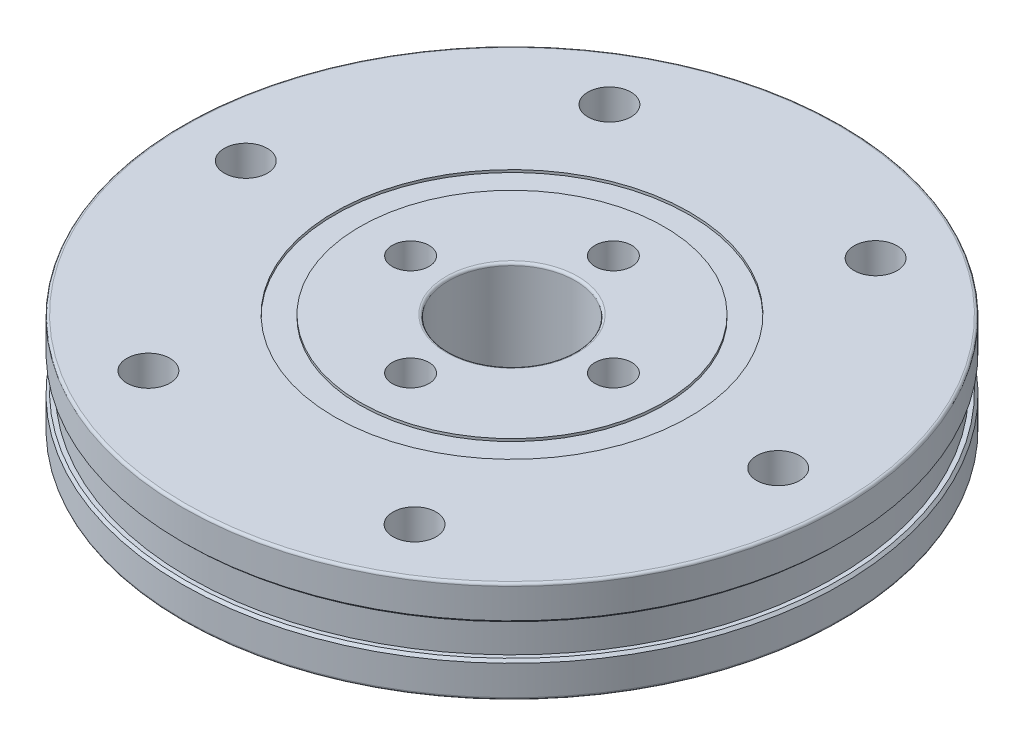
ISO-10303-21;
HEADER;
FILE_DESCRIPTION(('STEP AP214'),'2;1');
FILE_NAME('part.step','',(''),(''),'','','');
FILE_SCHEMA(('AUTOMOTIVE_DESIGN { 1 0 10303 214 1 1 1 1 }'));
ENDSEC;
DATA;
#1=APPLICATION_CONTEXT('core data for automotive mechanical design processes');
#2=APPLICATION_PROTOCOL_DEFINITION('international standard','automotive_design',2000,#1);
#3=PRODUCT_CONTEXT('',#1,'mechanical');
#4=PRODUCT('Part','Part','',(#3));
#5=PRODUCT_RELATED_PRODUCT_CATEGORY('part','',(#4));
#6=PRODUCT_DEFINITION_FORMATION('','',#4);
#7=PRODUCT_DEFINITION_CONTEXT('part definition',#1,'design');
#8=PRODUCT_DEFINITION('design','',#6,#7);
#9=PRODUCT_DEFINITION_SHAPE('','',#8);
#10=(LENGTH_UNIT() NAMED_UNIT(*) SI_UNIT(.MILLI.,.METRE.));
#11=(NAMED_UNIT(*) PLANE_ANGLE_UNIT() SI_UNIT($,.RADIAN.));
#12=(NAMED_UNIT(*) SI_UNIT($,.STERADIAN.) SOLID_ANGLE_UNIT());
#13=UNCERTAINTY_MEASURE_WITH_UNIT(LENGTH_MEASURE(1.E-05),#10,'distance_accuracy_value','');
#14=(GEOMETRIC_REPRESENTATION_CONTEXT(3) GLOBAL_UNCERTAINTY_ASSIGNED_CONTEXT((#13)) GLOBAL_UNIT_ASSIGNED_CONTEXT((#10,
#11,#12)) REPRESENTATION_CONTEXT('',''));
#15=CARTESIAN_POINT('',(0.,0.,0.));
#16=DIRECTION('',(0.,0.,1.));
#17=DIRECTION('',(1.,0.,0.));
#18=AXIS2_PLACEMENT_3D('',#15,#16,#17);
#19=CARTESIAN_POINT('',(10.5,4.,-18.1865334794732));
#20=DIRECTION('',(0.,-1.,0.));
#21=DIRECTION('',(0.,0.,-1.));
#22=AXIS2_PLACEMENT_3D('',#19,#20,#21);
#23=CYLINDRICAL_SURFACE('',#22,1.7);
#24=CARTESIAN_POINT('',(10.5,4.,-18.1865334794732));
#25=DIRECTION('',(0.,1.,0.));
#26=DIRECTION('',(0.,0.,1.));
#27=AXIS2_PLACEMENT_3D('',#24,#25,#26);
#28=CIRCLE('',#27,1.7);
#29=CARTESIAN_POINT('',(10.5,4.,-16.4865334794732));
#30=VERTEX_POINT('',#29);
#31=EDGE_CURVE('E188',#30,#30,#28,.T.);
#32=ORIENTED_EDGE('',*,*,#31,.T.);
#33=EDGE_LOOP('',(#32));
#34=FACE_BOUND('',#33,.T.);
#35=CARTESIAN_POINT('',(10.5,-0.7,-18.1865334794732));
#36=DIRECTION('',(0.,-1.,0.));
#37=DIRECTION('',(0.,0.,-1.));
#38=AXIS2_PLACEMENT_3D('',#35,#36,#37);
#39=CIRCLE('',#38,1.7);
#40=CARTESIAN_POINT('',(10.5,-0.7,-19.8865334794732));
#41=VERTEX_POINT('',#40);
#42=EDGE_CURVE('E52',#41,#41,#39,.T.);
#43=ORIENTED_EDGE('',*,*,#42,.T.);
#44=EDGE_LOOP('',(#43));
#45=FACE_BOUND('',#44,.T.);
#46=ADVANCED_FACE('F48',(#34,#45),#23,.F.);
#47=CARTESIAN_POINT('',(-10.5,4.,-18.1865334794732));
#48=DIRECTION('',(0.,-1.,0.));
#49=DIRECTION('',(0.,0.,-1.));
#50=AXIS2_PLACEMENT_3D('',#47,#48,#49);
#51=CYLINDRICAL_SURFACE('',#50,1.7);
#52=CARTESIAN_POINT('',(-10.5,4.,-18.1865334794732));
#53=DIRECTION('',(0.,1.,0.));
#54=DIRECTION('',(0.,0.,1.));
#55=AXIS2_PLACEMENT_3D('',#52,#53,#54);
#56=CIRCLE('',#55,1.7);
#57=CARTESIAN_POINT('',(-10.5,4.,-16.4865334794732));
#58=VERTEX_POINT('',#57);
#59=EDGE_CURVE('E184',#58,#58,#56,.T.);
#60=ORIENTED_EDGE('',*,*,#59,.T.);
#61=EDGE_LOOP('',(#60));
#62=FACE_BOUND('',#61,.T.);
#63=CARTESIAN_POINT('',(-10.5,-0.7,-18.1865334794732));
#64=DIRECTION('',(0.,-1.,0.));
#65=DIRECTION('',(0.,0.,-1.));
#66=AXIS2_PLACEMENT_3D('',#63,#64,#65);
#67=CIRCLE('',#66,1.7);
#68=CARTESIAN_POINT('',(-10.5,-0.7,-19.8865334794732));
#69=VERTEX_POINT('',#68);
#70=EDGE_CURVE('E83',#69,#69,#67,.T.);
#71=ORIENTED_EDGE('',*,*,#70,.T.);
#72=EDGE_LOOP('',(#71));
#73=FACE_BOUND('',#72,.T.);
#74=ADVANCED_FACE('F259',(#62,#73),#51,.F.);
#75=CARTESIAN_POINT('',(21.,4.,0.));
#76=DIRECTION('',(0.,-1.,0.));
#77=DIRECTION('',(0.,0.,-1.));
#78=AXIS2_PLACEMENT_3D('',#75,#76,#77);
#79=CYLINDRICAL_SURFACE('',#78,1.7);
#80=CARTESIAN_POINT('',(21.,4.,0.));
#81=DIRECTION('',(0.,1.,0.));
#82=DIRECTION('',(0.,0.,1.));
#83=AXIS2_PLACEMENT_3D('',#80,#81,#82);
#84=CIRCLE('',#83,1.7);
#85=CARTESIAN_POINT('',(21.,4.,1.69999999999999));
#86=VERTEX_POINT('',#85);
#87=EDGE_CURVE('E180',#86,#86,#84,.T.);
#88=ORIENTED_EDGE('',*,*,#87,.T.);
#89=EDGE_LOOP('',(#88));
#90=FACE_BOUND('',#89,.T.);
#91=CARTESIAN_POINT('',(21.,-0.7,0.));
#92=DIRECTION('',(0.,-1.,0.));
#93=DIRECTION('',(0.,0.,-1.));
#94=AXIS2_PLACEMENT_3D('',#91,#92,#93);
#95=CIRCLE('',#94,1.7);
#96=CARTESIAN_POINT('',(21.,-0.7,-1.70000000000001));
#97=VERTEX_POINT('',#96);
#98=EDGE_CURVE('E80',#97,#97,#95,.T.);
#99=ORIENTED_EDGE('',*,*,#98,.T.);
#100=EDGE_LOOP('',(#99));
#101=FACE_BOUND('',#100,.T.);
#102=ADVANCED_FACE('F266',(#90,#101),#79,.F.);
#103=CARTESIAN_POINT('',(10.5,4.,18.1865334794732));
#104=DIRECTION('',(0.,-1.,0.));
#105=DIRECTION('',(0.,0.,-1.));
#106=AXIS2_PLACEMENT_3D('',#103,#104,#105);
#107=CYLINDRICAL_SURFACE('',#106,1.7);
#108=CARTESIAN_POINT('',(10.5,4.,18.1865334794732));
#109=DIRECTION('',(0.,1.,0.));
#110=DIRECTION('',(0.,0.,1.));
#111=AXIS2_PLACEMENT_3D('',#108,#109,#110);
#112=CIRCLE('',#111,1.7);
#113=CARTESIAN_POINT('',(10.5,4.,19.8865334794732));
#114=VERTEX_POINT('',#113);
#115=EDGE_CURVE('E176',#114,#114,#112,.T.);
#116=ORIENTED_EDGE('',*,*,#115,.T.);
#117=EDGE_LOOP('',(#116));
#118=FACE_BOUND('',#117,.T.);
#119=CARTESIAN_POINT('',(10.5,-0.7,18.1865334794732));
#120=DIRECTION('',(0.,-1.,0.));
#121=DIRECTION('',(0.,0.,-1.));
#122=AXIS2_PLACEMENT_3D('',#119,#120,#121);
#123=CIRCLE('',#122,1.7);
#124=CARTESIAN_POINT('',(10.5,-0.7,16.4865334794732));
#125=VERTEX_POINT('',#124);
#126=EDGE_CURVE('E76',#125,#125,#123,.T.);
#127=ORIENTED_EDGE('',*,*,#126,.T.);
#128=EDGE_LOOP('',(#127));
#129=FACE_BOUND('',#128,.T.);
#130=ADVANCED_FACE('F272',(#118,#129),#107,.F.);
#131=CARTESIAN_POINT('',(-10.5,4.,18.1865334794732));
#132=DIRECTION('',(0.,-1.,0.));
#133=DIRECTION('',(0.,0.,-1.));
#134=AXIS2_PLACEMENT_3D('',#131,#132,#133);
#135=CYLINDRICAL_SURFACE('',#134,1.7);
#136=CARTESIAN_POINT('',(-10.5,4.,18.1865334794732));
#137=DIRECTION('',(0.,1.,0.));
#138=DIRECTION('',(0.,0.,1.));
#139=AXIS2_PLACEMENT_3D('',#136,#137,#138);
#140=CIRCLE('',#139,1.7);
#141=CARTESIAN_POINT('',(-10.5,4.,19.8865334794732));
#142=VERTEX_POINT('',#141);
#143=EDGE_CURVE('E172',#142,#142,#140,.T.);
#144=ORIENTED_EDGE('',*,*,#143,.T.);
#145=EDGE_LOOP('',(#144));
#146=FACE_BOUND('',#145,.T.);
#147=CARTESIAN_POINT('',(-10.5,-0.7,18.1865334794732));
#148=DIRECTION('',(0.,-1.,0.));
#149=DIRECTION('',(0.,0.,-1.));
#150=AXIS2_PLACEMENT_3D('',#147,#148,#149);
#151=CIRCLE('',#150,1.7);
#152=CARTESIAN_POINT('',(-10.5,-0.7,16.4865334794732));
#153=VERTEX_POINT('',#152);
#154=EDGE_CURVE('E71',#153,#153,#151,.T.);
#155=ORIENTED_EDGE('',*,*,#154,.T.);
#156=EDGE_LOOP('',(#155));
#157=FACE_BOUND('',#156,.T.);
#158=ADVANCED_FACE('F276',(#146,#157),#135,.F.);
#159=CARTESIAN_POINT('',(-21.,4.,0.));
#160=DIRECTION('',(0.,-1.,0.));
#161=DIRECTION('',(0.,0.,-1.));
#162=AXIS2_PLACEMENT_3D('',#159,#160,#161);
#163=CYLINDRICAL_SURFACE('',#162,1.7);
#164=CARTESIAN_POINT('',(-21.,4.,0.));
#165=DIRECTION('',(0.,1.,0.));
#166=DIRECTION('',(0.,0.,1.));
#167=AXIS2_PLACEMENT_3D('',#164,#165,#166);
#168=CIRCLE('',#167,1.7);
#169=CARTESIAN_POINT('',(-21.,4.,1.7));
#170=VERTEX_POINT('',#169);
#171=EDGE_CURVE('E165',#170,#170,#168,.T.);
#172=ORIENTED_EDGE('',*,*,#171,.T.);
#173=EDGE_LOOP('',(#172));
#174=FACE_BOUND('',#173,.T.);
#175=CARTESIAN_POINT('',(-21.,-0.7,0.));
#176=DIRECTION('',(0.,-1.,0.));
#177=DIRECTION('',(0.,0.,-1.));
#178=AXIS2_PLACEMENT_3D('',#175,#176,#177);
#179=CIRCLE('',#178,1.7);
#180=CARTESIAN_POINT('',(-21.,-0.7,-1.7));
#181=VERTEX_POINT('',#180);
#182=EDGE_CURVE('E67',#181,#181,#179,.T.);
#183=ORIENTED_EDGE('',*,*,#182,.T.);
#184=EDGE_LOOP('',(#183));
#185=FACE_BOUND('',#184,.T.);
#186=ADVANCED_FACE('F280',(#174,#185),#163,.F.);
#187=CARTESIAN_POINT('',(0.,4.,0.));
#188=DIRECTION('',(0.,-1.,0.));
#189=DIRECTION('',(0.,0.,-1.));
#190=AXIS2_PLACEMENT_3D('',#187,#188,#189);
#191=CYLINDRICAL_SURFACE('',#190,26.);
#192=CARTESIAN_POINT('',(0.,-3.8,0.));
#193=DIRECTION('',(0.,1.,0.));
#194=DIRECTION('',(0.,0.,1.));
#195=AXIS2_PLACEMENT_3D('',#192,#193,#194);
#196=CIRCLE('',#195,26.);
#197=CARTESIAN_POINT('',(0.,-3.8,26.));
#198=VERTEX_POINT('',#197);
#199=EDGE_CURVE('E220',#198,#198,#196,.T.);
#200=ORIENTED_EDGE('',*,*,#199,.T.);
#201=EDGE_LOOP('',(#200));
#202=FACE_BOUND('',#201,.T.);
#203=CARTESIAN_POINT('',(0.,-1.45,0.));
#204=DIRECTION('',(0.,1.,0.));
#205=DIRECTION('',(0.,0.,1.));
#206=AXIS2_PLACEMENT_3D('',#203,#204,#205);
#207=CIRCLE('',#206,26.);
#208=CARTESIAN_POINT('',(0.,-1.45,26.));
#209=VERTEX_POINT('',#208);
#210=EDGE_CURVE('E196',#209,#209,#207,.F.);
#211=ORIENTED_EDGE('',*,*,#210,.T.);
#212=EDGE_LOOP('',(#211));
#213=FACE_BOUND('',#212,.T.);
#214=ADVANCED_FACE('F255',(#202,#213),#191,.T.);
#215=CARTESIAN_POINT('',(0.,-4.,0.));
#216=DIRECTION('',(0.,1.,0.));
#217=DIRECTION('',(0.,0.,1.));
#218=AXIS2_PLACEMENT_3D('',#215,#216,#217);
#219=PLANE('',#218);
#220=CARTESIAN_POINT('',(0.,-4.,0.));
#221=DIRECTION('',(0.,1.,0.));
#222=DIRECTION('',(0.,0.,1.));
#223=AXIS2_PLACEMENT_3D('',#220,#221,#222);
#224=CIRCLE('',#223,5.2);
#225=CARTESIAN_POINT('',(0.,-4.,5.2));
#226=VERTEX_POINT('',#225);
#227=EDGE_CURVE('E208',#226,#226,#224,.T.);
#228=ORIENTED_EDGE('',*,*,#227,.T.);
#229=EDGE_LOOP('',(#228));
#230=FACE_BOUND('',#229,.T.);
#231=CARTESIAN_POINT('',(-7.99999999999999,-4.,0.));
#232=DIRECTION('',(0.,1.,0.));
#233=DIRECTION('',(0.,0.,1.));
#234=AXIS2_PLACEMENT_3D('',#231,#232,#233);
#235=CIRCLE('',#234,1.45);
#236=CARTESIAN_POINT('',(-7.99999999999999,-4.,1.45));
#237=VERTEX_POINT('',#236);
#238=EDGE_CURVE('E133',#237,#237,#235,.T.);
#239=ORIENTED_EDGE('',*,*,#238,.T.);
#240=EDGE_LOOP('',(#239));
#241=FACE_BOUND('',#240,.T.);
#242=CARTESIAN_POINT('',(0.,-4.,8.));
#243=DIRECTION('',(0.,1.,0.));
#244=DIRECTION('',(0.,0.,1.));
#245=AXIS2_PLACEMENT_3D('',#242,#243,#244);
#246=CIRCLE('',#245,1.45);
#247=CARTESIAN_POINT('',(0.,-4.,9.45));
#248=VERTEX_POINT('',#247);
#249=EDGE_CURVE('E141',#248,#248,#246,.T.);
#250=ORIENTED_EDGE('',*,*,#249,.T.);
#251=EDGE_LOOP('',(#250));
#252=FACE_BOUND('',#251,.T.);
#253=CARTESIAN_POINT('',(0.,-4.,-7.99999999999999));
#254=DIRECTION('',(0.,1.,0.));
#255=DIRECTION('',(0.,0.,1.));
#256=AXIS2_PLACEMENT_3D('',#253,#254,#255);
#257=CIRCLE('',#256,1.45);
#258=CARTESIAN_POINT('',(0.,-4.,-6.54999999999999));
#259=VERTEX_POINT('',#258);
#260=EDGE_CURVE('E149',#259,#259,#257,.T.);
#261=ORIENTED_EDGE('',*,*,#260,.T.);
#262=EDGE_LOOP('',(#261));
#263=FACE_BOUND('',#262,.T.);
#264=CARTESIAN_POINT('',(7.99999999999999,-4.,0.));
#265=DIRECTION('',(0.,1.,0.));
#266=DIRECTION('',(0.,0.,1.));
#267=AXIS2_PLACEMENT_3D('',#264,#265,#266);
#268=CIRCLE('',#267,1.45);
#269=CARTESIAN_POINT('',(7.99999999999999,-4.,1.45000000000001));
#270=VERTEX_POINT('',#269);
#271=EDGE_CURVE('E157',#270,#270,#268,.T.);
#272=ORIENTED_EDGE('',*,*,#271,.T.);
#273=EDGE_LOOP('',(#272));
#274=FACE_BOUND('',#273,.T.);
#275=CARTESIAN_POINT('',(0.,-4.,0.));
#276=DIRECTION('',(0.,-1.,0.));
#277=DIRECTION('',(0.,0.,-1.));
#278=AXIS2_PLACEMENT_3D('',#275,#276,#277);
#279=CIRCLE('',#278,12.);
#280=CARTESIAN_POINT('',(0.,-4.,-12.));
#281=VERTEX_POINT('',#280);
#282=EDGE_CURVE('E101',#281,#281,#279,.T.);
#283=ORIENTED_EDGE('',*,*,#282,.T.);
#284=EDGE_LOOP('',(#283));
#285=FACE_BOUND('',#284,.T.);
#286=ADVANCED_FACE('F439',(#230,#241,#252,#263,#274,#285),#219,.F.);
#287=CARTESIAN_POINT('',(0.,4.,0.));
#288=DIRECTION('',(0.,1.,0.));
#289=DIRECTION('',(0.,0.,1.));
#290=AXIS2_PLACEMENT_3D('',#287,#288,#289);
#291=PLANE('',#290);
#292=CARTESIAN_POINT('',(0.,4.,0.));
#293=DIRECTION('',(0.,1.,0.));
#294=DIRECTION('',(0.,0.,1.));
#295=AXIS2_PLACEMENT_3D('',#292,#293,#294);
#296=CIRCLE('',#295,5.2);
#297=CARTESIAN_POINT('',(0.,4.,5.2));
#298=VERTEX_POINT('',#297);
#299=EDGE_CURVE('E63',#298,#298,#296,.F.);
#300=ORIENTED_EDGE('',*,*,#299,.T.);
#301=EDGE_LOOP('',(#300));
#302=FACE_BOUND('',#301,.T.);
#303=CARTESIAN_POINT('',(-7.99999999999999,4.,0.));
#304=DIRECTION('',(0.,1.,0.));
#305=DIRECTION('',(0.,0.,1.));
#306=AXIS2_PLACEMENT_3D('',#303,#304,#305);
#307=CIRCLE('',#306,1.45);
#308=CARTESIAN_POINT('',(-7.99999999999999,4.,1.45));
#309=VERTEX_POINT('',#308);
#310=EDGE_CURVE('E137',#309,#309,#307,.T.);
#311=ORIENTED_EDGE('',*,*,#310,.F.);
#312=EDGE_LOOP('',(#311));
#313=FACE_BOUND('',#312,.T.);
#314=CARTESIAN_POINT('',(0.,4.,-7.99999999999999));
#315=DIRECTION('',(0.,1.,0.));
#316=DIRECTION('',(0.,0.,1.));
#317=AXIS2_PLACEMENT_3D('',#314,#315,#316);
#318=CIRCLE('',#317,1.45);
#319=CARTESIAN_POINT('',(0.,4.,-6.54999999999999));
#320=VERTEX_POINT('',#319);
#321=EDGE_CURVE('E153',#320,#320,#318,.T.);
#322=ORIENTED_EDGE('',*,*,#321,.F.);
#323=EDGE_LOOP('',(#322));
#324=FACE_BOUND('',#323,.T.);
#325=CARTESIAN_POINT('',(7.99999999999999,4.,0.));
#326=DIRECTION('',(0.,1.,0.));
#327=DIRECTION('',(0.,0.,1.));
#328=AXIS2_PLACEMENT_3D('',#325,#326,#327);
#329=CIRCLE('',#328,1.45);
#330=CARTESIAN_POINT('',(7.99999999999999,4.,1.45000000000001));
#331=VERTEX_POINT('',#330);
#332=EDGE_CURVE('E161',#331,#331,#329,.T.);
#333=ORIENTED_EDGE('',*,*,#332,.F.);
#334=EDGE_LOOP('',(#333));
#335=FACE_BOUND('',#334,.T.);
#336=CARTESIAN_POINT('',(0.,4.,8.));
#337=DIRECTION('',(0.,1.,0.));
#338=DIRECTION('',(0.,0.,1.));
#339=AXIS2_PLACEMENT_3D('',#336,#337,#338);
#340=CIRCLE('',#339,1.45);
#341=CARTESIAN_POINT('',(0.,4.,9.45));
#342=VERTEX_POINT('',#341);
#343=EDGE_CURVE('E145',#342,#342,#340,.T.);
#344=ORIENTED_EDGE('',*,*,#343,.F.);
#345=EDGE_LOOP('',(#344));
#346=FACE_BOUND('',#345,.T.);
#347=CARTESIAN_POINT('',(0.,4.,0.));
#348=DIRECTION('',(0.,1.,0.));
#349=DIRECTION('',(0.,0.,1.));
#350=AXIS2_PLACEMENT_3D('',#347,#348,#349);
#351=CIRCLE('',#350,12.);
#352=CARTESIAN_POINT('',(0.,4.,12.));
#353=VERTEX_POINT('',#352);
#354=EDGE_CURVE('E117',#353,#353,#351,.T.);
#355=ORIENTED_EDGE('',*,*,#354,.T.);
#356=EDGE_LOOP('',(#355));
#357=FACE_BOUND('',#356,.T.);
#358=ADVANCED_FACE('F231',(#302,#313,#324,#335,#346,#357),#291,.T.);
#359=CARTESIAN_POINT('',(0.,4.,0.));
#360=DIRECTION('',(0.,1.,0.));
#361=DIRECTION('',(0.,0.,1.));
#362=AXIS2_PLACEMENT_3D('',#359,#360,#361);
#363=CIRCLE('',#362,25.8);
#364=CARTESIAN_POINT('',(0.,4.,25.8));
#365=VERTEX_POINT('',#364);
#366=EDGE_CURVE('E57',#365,#365,#363,.T.);
#367=ORIENTED_EDGE('',*,*,#366,.T.);
#368=EDGE_LOOP('',(#367));
#369=FACE_BOUND('',#368,.T.);
#370=CARTESIAN_POINT('',(0.,4.,0.));
#371=DIRECTION('',(0.,1.,0.));
#372=DIRECTION('',(0.,0.,1.));
#373=AXIS2_PLACEMENT_3D('',#370,#371,#372);
#374=CIRCLE('',#373,14.);
#375=CARTESIAN_POINT('',(0.,4.,14.));
#376=VERTEX_POINT('',#375);
#377=EDGE_CURVE('E125',#376,#376,#374,.T.);
#378=ORIENTED_EDGE('',*,*,#377,.F.);
#379=EDGE_LOOP('',(#378));
#380=FACE_BOUND('',#379,.T.);
#381=ORIENTED_EDGE('',*,*,#143,.F.);
#382=EDGE_LOOP('',(#381));
#383=FACE_BOUND('',#382,.T.);
#384=ORIENTED_EDGE('',*,*,#87,.F.);
#385=EDGE_LOOP('',(#384));
#386=FACE_BOUND('',#385,.T.);
#387=ORIENTED_EDGE('',*,*,#31,.F.);
#388=EDGE_LOOP('',(#387));
#389=FACE_BOUND('',#388,.T.);
#390=ORIENTED_EDGE('',*,*,#59,.F.);
#391=EDGE_LOOP('',(#390));
#392=FACE_BOUND('',#391,.T.);
#393=ORIENTED_EDGE('',*,*,#115,.F.);
#394=EDGE_LOOP('',(#393));
#395=FACE_BOUND('',#394,.T.);
#396=ORIENTED_EDGE('',*,*,#171,.F.);
#397=EDGE_LOOP('',(#396));
#398=FACE_BOUND('',#397,.T.);
#399=ADVANCED_FACE('F436',(#369,#380,#383,#386,#389,#392,#395,#398),#291,.T.);
#400=CARTESIAN_POINT('',(-21.,-4.,0.));
#401=DIRECTION('',(0.,-1.,0.));
#402=DIRECTION('',(0.,0.,-1.));
#403=AXIS2_PLACEMENT_3D('',#400,#401,#402);
#404=CIRCLE('',#403,3.25);
#405=CARTESIAN_POINT('',(-21.,-4.,-3.25));
#406=VERTEX_POINT('',#405);
#407=EDGE_CURVE('E387',#406,#406,#404,.T.);
#408=ORIENTED_EDGE('',*,*,#407,.F.);
#409=EDGE_LOOP('',(#408));
#410=FACE_BOUND('',#409,.T.);
#411=CARTESIAN_POINT('',(-10.5,-4.,18.1865334794732));
#412=DIRECTION('',(0.,-1.,0.));
#413=DIRECTION('',(0.,0.,-1.));
#414=AXIS2_PLACEMENT_3D('',#411,#412,#413);
#415=CIRCLE('',#414,3.25);
#416=CARTESIAN_POINT('',(-10.5,-4.,14.9365334794732));
#417=VERTEX_POINT('',#416);
#418=EDGE_CURVE('E399',#417,#417,#415,.T.);
#419=ORIENTED_EDGE('',*,*,#418,.F.);
#420=EDGE_LOOP('',(#419));
#421=FACE_BOUND('',#420,.T.);
#422=CARTESIAN_POINT('',(10.5,-4.,18.1865334794732));
#423=DIRECTION('',(0.,-1.,0.));
#424=DIRECTION('',(0.,0.,-1.));
#425=AXIS2_PLACEMENT_3D('',#422,#423,#424);
#426=CIRCLE('',#425,3.25);
#427=CARTESIAN_POINT('',(10.5,-4.,14.9365334794732));
#428=VERTEX_POINT('',#427);
#429=EDGE_CURVE('E398',#428,#428,#426,.T.);
#430=ORIENTED_EDGE('',*,*,#429,.F.);
#431=EDGE_LOOP('',(#430));
#432=FACE_BOUND('',#431,.T.);
#433=CARTESIAN_POINT('',(21.,-4.,0.));
#434=DIRECTION('',(0.,-1.,0.));
#435=DIRECTION('',(0.,0.,-1.));
#436=AXIS2_PLACEMENT_3D('',#433,#434,#435);
#437=CIRCLE('',#436,3.25);
#438=CARTESIAN_POINT('',(21.,-4.,-3.25000000000001));
#439=VERTEX_POINT('',#438);
#440=EDGE_CURVE('E422',#439,#439,#437,.T.);
#441=ORIENTED_EDGE('',*,*,#440,.F.);
#442=EDGE_LOOP('',(#441));
#443=FACE_BOUND('',#442,.T.);
#444=CARTESIAN_POINT('',(10.5,-4.,-18.1865334794732));
#445=DIRECTION('',(0.,-1.,0.));
#446=DIRECTION('',(0.,0.,-1.));
#447=AXIS2_PLACEMENT_3D('',#444,#445,#446);
#448=CIRCLE('',#447,3.25);
#449=CARTESIAN_POINT('',(10.5,-4.,-21.4365334794732));
#450=VERTEX_POINT('',#449);
#451=EDGE_CURVE('E414',#450,#450,#448,.T.);
#452=ORIENTED_EDGE('',*,*,#451,.F.);
#453=EDGE_LOOP('',(#452));
#454=FACE_BOUND('',#453,.T.);
#455=CARTESIAN_POINT('',(-10.5,-4.,-18.1865334794732));
#456=DIRECTION('',(0.,-1.,0.));
#457=DIRECTION('',(0.,0.,-1.));
#458=AXIS2_PLACEMENT_3D('',#455,#456,#457);
#459=CIRCLE('',#458,3.25);
#460=CARTESIAN_POINT('',(-10.5,-4.,-21.4365334794732));
#461=VERTEX_POINT('',#460);
#462=EDGE_CURVE('E406',#461,#461,#459,.T.);
#463=ORIENTED_EDGE('',*,*,#462,.F.);
#464=EDGE_LOOP('',(#463));
#465=FACE_BOUND('',#464,.T.);
#466=CARTESIAN_POINT('',(0.,-4.,0.));
#467=DIRECTION('',(0.,1.,0.));
#468=DIRECTION('',(0.,0.,1.));
#469=AXIS2_PLACEMENT_3D('',#466,#467,#468);
#470=CIRCLE('',#469,25.8);
#471=CARTESIAN_POINT('',(0.,-4.,25.8));
#472=VERTEX_POINT('',#471);
#473=EDGE_CURVE('E224',#472,#472,#470,.F.);
#474=ORIENTED_EDGE('',*,*,#473,.T.);
#475=EDGE_LOOP('',(#474));
#476=FACE_BOUND('',#475,.T.);
#477=CARTESIAN_POINT('',(0.,-4.,0.));
#478=DIRECTION('',(0.,-1.,0.));
#479=DIRECTION('',(0.,0.,-1.));
#480=AXIS2_PLACEMENT_3D('',#477,#478,#479);
#481=CIRCLE('',#480,14.);
#482=CARTESIAN_POINT('',(0.,-4.,-14.));
#483=VERTEX_POINT('',#482);
#484=EDGE_CURVE('E109',#483,#483,#481,.T.);
#485=ORIENTED_EDGE('',*,*,#484,.F.);
#486=EDGE_LOOP('',(#485));
#487=FACE_BOUND('',#486,.T.);
#488=ADVANCED_FACE('F253',(#410,#421,#432,#443,#454,#465,#476,#487),#219,.F.);
#489=CARTESIAN_POINT('',(0.,3.8,0.));
#490=DIRECTION('',(0.,1.,0.));
#491=DIRECTION('',(0.,0.,1.));
#492=AXIS2_PLACEMENT_3D('',#489,#490,#491);
#493=CIRCLE('',#492,26.);
#494=CARTESIAN_POINT('',(0.,3.8,26.));
#495=VERTEX_POINT('',#494);
#496=EDGE_CURVE('E11',#495,#495,#493,.F.);
#497=ORIENTED_EDGE('',*,*,#496,.T.);
#498=EDGE_LOOP('',(#497));
#499=FACE_BOUND('',#498,.T.);
#500=CARTESIAN_POINT('',(0.,1.45,0.));
#501=DIRECTION('',(0.,1.,0.));
#502=DIRECTION('',(0.,0.,1.));
#503=AXIS2_PLACEMENT_3D('',#500,#501,#502);
#504=CIRCLE('',#503,26.);
#505=CARTESIAN_POINT('',(0.,1.45,26.));
#506=VERTEX_POINT('',#505);
#507=EDGE_CURVE('E200',#506,#506,#504,.T.);
#508=ORIENTED_EDGE('',*,*,#507,.T.);
#509=EDGE_LOOP('',(#508));
#510=FACE_BOUND('',#509,.T.);
#511=ADVANCED_FACE('F243',(#499,#510),#191,.T.);
#512=CARTESIAN_POINT('',(0.,4.,0.));
#513=DIRECTION('',(0.,-1.,0.));
#514=DIRECTION('',(0.,0.,-1.));
#515=AXIS2_PLACEMENT_3D('',#512,#513,#514);
#516=CYLINDRICAL_SURFACE('',#515,5.);
#517=CARTESIAN_POINT('',(0.,-3.8,0.));
#518=DIRECTION('',(0.,1.,0.));
#519=DIRECTION('',(0.,0.,1.));
#520=AXIS2_PLACEMENT_3D('',#517,#518,#519);
#521=CIRCLE('',#520,5.);
#522=CARTESIAN_POINT('',(0.,-3.8,5.));
#523=VERTEX_POINT('',#522);
#524=EDGE_CURVE('E216',#523,#523,#521,.F.);
#525=ORIENTED_EDGE('',*,*,#524,.T.);
#526=EDGE_LOOP('',(#525));
#527=FACE_BOUND('',#526,.T.);
#528=CARTESIAN_POINT('',(0.,3.8,0.));
#529=DIRECTION('',(0.,1.,0.));
#530=DIRECTION('',(0.,0.,1.));
#531=AXIS2_PLACEMENT_3D('',#528,#529,#530);
#532=CIRCLE('',#531,5.);
#533=CARTESIAN_POINT('',(0.,3.8,5.));
#534=VERTEX_POINT('',#533);
#535=EDGE_CURVE('E212',#534,#534,#532,.T.);
#536=ORIENTED_EDGE('',*,*,#535,.T.);
#537=EDGE_LOOP('',(#536));
#538=FACE_BOUND('',#537,.T.);
#539=ADVANCED_FACE('F240',(#527,#538),#516,.F.);
#540=CARTESIAN_POINT('',(7.99999999999999,4.,0.));
#541=DIRECTION('',(0.,-1.,0.));
#542=DIRECTION('',(0.,0.,-1.));
#543=AXIS2_PLACEMENT_3D('',#540,#541,#542);
#544=CYLINDRICAL_SURFACE('',#543,1.45);
#545=ORIENTED_EDGE('',*,*,#332,.T.);
#546=EDGE_LOOP('',(#545));
#547=FACE_BOUND('',#546,.T.);
#548=ORIENTED_EDGE('',*,*,#271,.F.);
#549=EDGE_LOOP('',(#548));
#550=FACE_BOUND('',#549,.T.);
#551=ADVANCED_FACE('F242',(#547,#550),#544,.F.);
#552=CARTESIAN_POINT('',(0.,4.,-7.99999999999999));
#553=DIRECTION('',(0.,-1.,0.));
#554=DIRECTION('',(0.,0.,-1.));
#555=AXIS2_PLACEMENT_3D('',#552,#553,#554);
#556=CYLINDRICAL_SURFACE('',#555,1.45);
#557=ORIENTED_EDGE('',*,*,#321,.T.);
#558=EDGE_LOOP('',(#557));
#559=FACE_BOUND('',#558,.T.);
#560=ORIENTED_EDGE('',*,*,#260,.F.);
#561=EDGE_LOOP('',(#560));
#562=FACE_BOUND('',#561,.T.);
#563=ADVANCED_FACE('F250',(#559,#562),#556,.F.);
#564=CARTESIAN_POINT('',(0.,4.,8.));
#565=DIRECTION('',(0.,-1.,0.));
#566=DIRECTION('',(0.,0.,-1.));
#567=AXIS2_PLACEMENT_3D('',#564,#565,#566);
#568=CYLINDRICAL_SURFACE('',#567,1.45);
#569=ORIENTED_EDGE('',*,*,#343,.T.);
#570=EDGE_LOOP('',(#569));
#571=FACE_BOUND('',#570,.T.);
#572=ORIENTED_EDGE('',*,*,#249,.F.);
#573=EDGE_LOOP('',(#572));
#574=FACE_BOUND('',#573,.T.);
#575=ADVANCED_FACE('F287',(#571,#574),#568,.F.);
#576=CARTESIAN_POINT('',(-7.99999999999999,4.,0.));
#577=DIRECTION('',(0.,-1.,0.));
#578=DIRECTION('',(0.,0.,-1.));
#579=AXIS2_PLACEMENT_3D('',#576,#577,#578);
#580=CYLINDRICAL_SURFACE('',#579,1.45);
#581=ORIENTED_EDGE('',*,*,#310,.T.);
#582=EDGE_LOOP('',(#581));
#583=FACE_BOUND('',#582,.T.);
#584=ORIENTED_EDGE('',*,*,#238,.F.);
#585=EDGE_LOOP('',(#584));
#586=FACE_BOUND('',#585,.T.);
#587=ADVANCED_FACE('F291',(#583,#586),#580,.F.);
#588=CARTESIAN_POINT('',(0.,3.8,0.));
#589=DIRECTION('',(0.,1.,0.));
#590=DIRECTION('',(0.,0.,1.));
#591=AXIS2_PLACEMENT_3D('',#588,#589,#590);
#592=CYLINDRICAL_SURFACE('',#591,14.);
#593=CARTESIAN_POINT('',(0.,3.8,0.));
#594=DIRECTION('',(0.,1.,0.));
#595=DIRECTION('',(0.,0.,1.));
#596=AXIS2_PLACEMENT_3D('',#593,#594,#595);
#597=CIRCLE('',#596,14.);
#598=CARTESIAN_POINT('',(0.,3.8,14.));
#599=VERTEX_POINT('',#598);
#600=EDGE_CURVE('E129',#599,#599,#597,.T.);
#601=ORIENTED_EDGE('',*,*,#600,.F.);
#602=EDGE_LOOP('',(#601));
#603=FACE_BOUND('',#602,.T.);
#604=ORIENTED_EDGE('',*,*,#377,.T.);
#605=EDGE_LOOP('',(#604));
#606=FACE_BOUND('',#605,.T.);
#607=ADVANCED_FACE('F295',(#603,#606),#592,.F.);
#608=CARTESIAN_POINT('',(0.,3.8,0.));
#609=DIRECTION('',(0.,1.,0.));
#610=DIRECTION('',(0.,0.,1.));
#611=AXIS2_PLACEMENT_3D('',#608,#609,#610);
#612=PLANE('',#611);
#613=CARTESIAN_POINT('',(0.,3.8,0.));
#614=DIRECTION('',(0.,1.,0.));
#615=DIRECTION('',(0.,0.,1.));
#616=AXIS2_PLACEMENT_3D('',#613,#614,#615);
#617=CIRCLE('',#616,12.);
#618=CARTESIAN_POINT('',(0.,3.8,12.));
#619=VERTEX_POINT('',#618);
#620=EDGE_CURVE('E121',#619,#619,#617,.T.);
#621=ORIENTED_EDGE('',*,*,#620,.F.);
#622=EDGE_LOOP('',(#621));
#623=FACE_BOUND('',#622,.T.);
#624=ORIENTED_EDGE('',*,*,#600,.T.);
#625=EDGE_LOOP('',(#624));
#626=FACE_BOUND('',#625,.T.);
#627=ADVANCED_FACE('F299',(#623,#626),#612,.T.);
#628=CARTESIAN_POINT('',(0.,3.8,0.));
#629=DIRECTION('',(0.,1.,0.));
#630=DIRECTION('',(0.,0.,1.));
#631=AXIS2_PLACEMENT_3D('',#628,#629,#630);
#632=CYLINDRICAL_SURFACE('',#631,12.);
#633=ORIENTED_EDGE('',*,*,#620,.T.);
#634=EDGE_LOOP('',(#633));
#635=FACE_BOUND('',#634,.T.);
#636=ORIENTED_EDGE('',*,*,#354,.F.);
#637=EDGE_LOOP('',(#636));
#638=FACE_BOUND('',#637,.T.);
#639=ADVANCED_FACE('F303',(#635,#638),#632,.T.);
#640=CARTESIAN_POINT('',(0.,-3.8,0.));
#641=DIRECTION('',(0.,-1.,0.));
#642=DIRECTION('',(0.,0.,-1.));
#643=AXIS2_PLACEMENT_3D('',#640,#641,#642);
#644=CYLINDRICAL_SURFACE('',#643,14.);
#645=CARTESIAN_POINT('',(0.,-3.8,0.));
#646=DIRECTION('',(0.,-1.,0.));
#647=DIRECTION('',(0.,0.,-1.));
#648=AXIS2_PLACEMENT_3D('',#645,#646,#647);
#649=CIRCLE('',#648,14.);
#650=CARTESIAN_POINT('',(0.,-3.8,-14.));
#651=VERTEX_POINT('',#650);
#652=EDGE_CURVE('E113',#651,#651,#649,.T.);
#653=ORIENTED_EDGE('',*,*,#652,.F.);
#654=EDGE_LOOP('',(#653));
#655=FACE_BOUND('',#654,.T.);
#656=ORIENTED_EDGE('',*,*,#484,.T.);
#657=EDGE_LOOP('',(#656));
#658=FACE_BOUND('',#657,.T.);
#659=ADVANCED_FACE('F307',(#655,#658),#644,.F.);
#660=CARTESIAN_POINT('',(0.,-3.8,0.));
#661=DIRECTION('',(0.,-1.,0.));
#662=DIRECTION('',(0.,0.,-1.));
#663=AXIS2_PLACEMENT_3D('',#660,#661,#662);
#664=PLANE('',#663);
#665=CARTESIAN_POINT('',(0.,-3.8,0.));
#666=DIRECTION('',(0.,-1.,0.));
#667=DIRECTION('',(0.,0.,-1.));
#668=AXIS2_PLACEMENT_3D('',#665,#666,#667);
#669=CIRCLE('',#668,12.);
#670=CARTESIAN_POINT('',(0.,-3.8,-12.));
#671=VERTEX_POINT('',#670);
#672=EDGE_CURVE('E105',#671,#671,#669,.T.);
#673=ORIENTED_EDGE('',*,*,#672,.F.);
#674=EDGE_LOOP('',(#673));
#675=FACE_BOUND('',#674,.T.);
#676=ORIENTED_EDGE('',*,*,#652,.T.);
#677=EDGE_LOOP('',(#676));
#678=FACE_BOUND('',#677,.T.);
#679=ADVANCED_FACE('F311',(#675,#678),#664,.T.);
#680=CARTESIAN_POINT('',(0.,-3.8,0.));
#681=DIRECTION('',(0.,-1.,0.));
#682=DIRECTION('',(0.,0.,-1.));
#683=AXIS2_PLACEMENT_3D('',#680,#681,#682);
#684=CYLINDRICAL_SURFACE('',#683,12.);
#685=ORIENTED_EDGE('',*,*,#672,.T.);
#686=EDGE_LOOP('',(#685));
#687=FACE_BOUND('',#686,.T.);
#688=ORIENTED_EDGE('',*,*,#282,.F.);
#689=EDGE_LOOP('',(#688));
#690=FACE_BOUND('',#689,.T.);
#691=ADVANCED_FACE('F315',(#687,#690),#684,.T.);
#692=CARTESIAN_POINT('',(0.,-1.25,0.));
#693=DIRECTION('',(0.,1.,0.));
#694=DIRECTION('',(0.,0.,1.));
#695=AXIS2_PLACEMENT_3D('',#692,#693,#694);
#696=PLANE('',#695);
#697=CARTESIAN_POINT('',(0.,-1.25,0.));
#698=DIRECTION('',(0.,1.,0.));
#699=DIRECTION('',(0.,0.,1.));
#700=AXIS2_PLACEMENT_3D('',#697,#698,#699);
#701=CIRCLE('',#700,25.8);
#702=CARTESIAN_POINT('',(0.,-1.25,25.8));
#703=VERTEX_POINT('',#702);
#704=EDGE_CURVE('E192',#703,#703,#701,.T.);
#705=ORIENTED_EDGE('',*,*,#704,.T.);
#706=EDGE_LOOP('',(#705));
#707=FACE_BOUND('',#706,.T.);
#708=CARTESIAN_POINT('',(0.,-1.25,0.));
#709=DIRECTION('',(0.,1.,0.));
#710=DIRECTION('',(0.,0.,1.));
#711=AXIS2_PLACEMENT_3D('',#708,#709,#710);
#712=CIRCLE('',#711,25.4684345101907);
#713=CARTESIAN_POINT('',(0.,-1.25,25.4684345101907));
#714=VERTEX_POINT('',#713);
#715=EDGE_CURVE('E95',#714,#714,#712,.T.);
#716=ORIENTED_EDGE('',*,*,#715,.F.);
#717=EDGE_LOOP('',(#716));
#718=FACE_BOUND('',#717,.T.);
#719=ADVANCED_FACE('F319',(#707,#718),#696,.T.);
#720=CARTESIAN_POINT('',(0.,1.25,0.));
#721=DIRECTION('',(0.,1.,0.));
#722=DIRECTION('',(0.,0.,1.));
#723=AXIS2_PLACEMENT_3D('',#720,#721,#722);
#724=PLANE('',#723);
#725=CARTESIAN_POINT('',(0.,1.25,0.));
#726=DIRECTION('',(0.,1.,0.));
#727=DIRECTION('',(0.,0.,1.));
#728=AXIS2_PLACEMENT_3D('',#725,#726,#727);
#729=CIRCLE('',#728,25.8);
#730=CARTESIAN_POINT('',(0.,1.25,25.8));
#731=VERTEX_POINT('',#730);
#732=EDGE_CURVE('E204',#731,#731,#729,.F.);
#733=ORIENTED_EDGE('',*,*,#732,.T.);
#734=EDGE_LOOP('',(#733));
#735=FACE_BOUND('',#734,.T.);
#736=CARTESIAN_POINT('',(0.,1.25,0.));
#737=DIRECTION('',(0.,1.,0.));
#738=DIRECTION('',(0.,0.,1.));
#739=AXIS2_PLACEMENT_3D('',#736,#737,#738);
#740=CIRCLE('',#739,25.4684345101907);
#741=CARTESIAN_POINT('',(0.,1.25,25.4684345101907));
#742=VERTEX_POINT('',#741);
#743=EDGE_CURVE('E90',#742,#742,#740,.T.);
#744=ORIENTED_EDGE('',*,*,#743,.T.);
#745=EDGE_LOOP('',(#744));
#746=FACE_BOUND('',#745,.T.);
#747=ADVANCED_FACE('F321',(#735,#746),#724,.F.);
#748=CARTESIAN_POINT('',(0.,-1.25,0.));
#749=DIRECTION('',(0.,1.,0.));
#750=DIRECTION('',(0.,0.,1.));
#751=AXIS2_PLACEMENT_3D('',#748,#749,#750);
#752=CYLINDRICAL_SURFACE('',#751,25.4684345101907);
#753=ORIENTED_EDGE('',*,*,#715,.T.);
#754=EDGE_LOOP('',(#753));
#755=FACE_BOUND('',#754,.T.);
#756=ORIENTED_EDGE('',*,*,#743,.F.);
#757=EDGE_LOOP('',(#756));
#758=FACE_BOUND('',#757,.T.);
#759=ADVANCED_FACE('F324',(#755,#758),#752,.T.);
#760=CARTESIAN_POINT('',(0.,-1.25,0.));
#761=DIRECTION('',(0.,-1.,0.));
#762=DIRECTION('',(0.,0.,-1.));
#763=AXIS2_PLACEMENT_3D('',#760,#761,#762);
#764=CONICAL_SURFACE('',#763,25.8,0.785398163397422);
#765=ORIENTED_EDGE('',*,*,#210,.F.);
#766=EDGE_LOOP('',(#765));
#767=FACE_BOUND('',#766,.T.);
#768=ORIENTED_EDGE('',*,*,#704,.F.);
#769=EDGE_LOOP('',(#768));
#770=FACE_BOUND('',#769,.T.);
#771=ADVANCED_FACE('F331',(#767,#770),#764,.T.);
#772=CARTESIAN_POINT('',(0.,1.45,0.));
#773=DIRECTION('',(0.,1.,0.));
#774=DIRECTION('',(0.,0.,1.));
#775=AXIS2_PLACEMENT_3D('',#772,#773,#774);
#776=CONICAL_SURFACE('',#775,26.,0.785398163397448);
#777=ORIENTED_EDGE('',*,*,#732,.F.);
#778=EDGE_LOOP('',(#777));
#779=FACE_BOUND('',#778,.T.);
#780=ORIENTED_EDGE('',*,*,#507,.F.);
#781=EDGE_LOOP('',(#780));
#782=FACE_BOUND('',#781,.T.);
#783=ADVANCED_FACE('F463',(#779,#782),#776,.T.);
#784=CARTESIAN_POINT('',(0.,-3.8,0.));
#785=DIRECTION('',(0.,1.,0.));
#786=DIRECTION('',(0.,0.,1.));
#787=AXIS2_PLACEMENT_3D('',#784,#785,#786);
#788=TOROIDAL_SURFACE('',#787,5.2,0.2);
#789=ORIENTED_EDGE('',*,*,#524,.F.);
#790=EDGE_LOOP('',(#789));
#791=FACE_BOUND('',#790,.T.);
#792=ORIENTED_EDGE('',*,*,#227,.F.);
#793=EDGE_LOOP('',(#792));
#794=FACE_BOUND('',#793,.T.);
#795=ADVANCED_FACE('F453',(#791,#794),#788,.T.);
#796=CARTESIAN_POINT('',(0.,-3.8,0.));
#797=DIRECTION('',(0.,1.,0.));
#798=DIRECTION('',(0.,0.,1.));
#799=AXIS2_PLACEMENT_3D('',#796,#797,#798);
#800=TOROIDAL_SURFACE('',#799,25.8,0.2);
#801=ORIENTED_EDGE('',*,*,#473,.F.);
#802=EDGE_LOOP('',(#801));
#803=FACE_BOUND('',#802,.T.);
#804=ORIENTED_EDGE('',*,*,#199,.F.);
#805=EDGE_LOOP('',(#804));
#806=FACE_BOUND('',#805,.T.);
#807=ADVANCED_FACE('F237',(#803,#806),#800,.T.);
#808=CARTESIAN_POINT('',(0.,3.8,0.));
#809=DIRECTION('',(0.,1.,0.));
#810=DIRECTION('',(0.,0.,1.));
#811=AXIS2_PLACEMENT_3D('',#808,#809,#810);
#812=TOROIDAL_SURFACE('',#811,5.2,0.2);
#813=ORIENTED_EDGE('',*,*,#299,.F.);
#814=EDGE_LOOP('',(#813));
#815=FACE_BOUND('',#814,.T.);
#816=ORIENTED_EDGE('',*,*,#535,.F.);
#817=EDGE_LOOP('',(#816));
#818=FACE_BOUND('',#817,.T.);
#819=ADVANCED_FACE('F234',(#815,#818),#812,.T.);
#820=CARTESIAN_POINT('',(0.,3.8,0.));
#821=DIRECTION('',(0.,1.,0.));
#822=DIRECTION('',(0.,0.,1.));
#823=AXIS2_PLACEMENT_3D('',#820,#821,#822);
#824=TOROIDAL_SURFACE('',#823,25.8,0.2);
#825=ORIENTED_EDGE('',*,*,#496,.F.);
#826=EDGE_LOOP('',(#825));
#827=FACE_BOUND('',#826,.T.);
#828=ORIENTED_EDGE('',*,*,#366,.F.);
#829=EDGE_LOOP('',(#828));
#830=FACE_BOUND('',#829,.T.);
#831=ADVANCED_FACE('F50',(#827,#830),#824,.T.);
#832=CARTESIAN_POINT('',(-21.,-0.7,0.));
#833=DIRECTION('',(0.,-1.,0.));
#834=DIRECTION('',(0.,0.,-1.));
#835=AXIS2_PLACEMENT_3D('',#832,#833,#834);
#836=CYLINDRICAL_SURFACE('',#835,3.25);
#837=CARTESIAN_POINT('',(-21.,-0.7,0.));
#838=DIRECTION('',(0.,-1.,0.));
#839=DIRECTION('',(0.,0.,-1.));
#840=AXIS2_PLACEMENT_3D('',#837,#838,#839);
#841=CIRCLE('',#840,3.25);
#842=CARTESIAN_POINT('',(-21.,-0.7,-3.25));
#843=VERTEX_POINT('',#842);
#844=EDGE_CURVE('E72',#843,#843,#841,.T.);
#845=ORIENTED_EDGE('',*,*,#844,.F.);
#846=EDGE_LOOP('',(#845));
#847=FACE_BOUND('',#846,.T.);
#848=ORIENTED_EDGE('',*,*,#407,.T.);
#849=EDGE_LOOP('',(#848));
#850=FACE_BOUND('',#849,.T.);
#851=ADVANCED_FACE('F374',(#847,#850),#836,.F.);
#852=CARTESIAN_POINT('',(-21.,-0.7,0.));
#853=DIRECTION('',(0.,-1.,0.));
#854=DIRECTION('',(0.,0.,-1.));
#855=AXIS2_PLACEMENT_3D('',#852,#853,#854);
#856=PLANE('',#855);
#857=ORIENTED_EDGE('',*,*,#182,.F.);
#858=EDGE_LOOP('',(#857));
#859=FACE_BOUND('',#858,.T.);
#860=ORIENTED_EDGE('',*,*,#844,.T.);
#861=EDGE_LOOP('',(#860));
#862=FACE_BOUND('',#861,.T.);
#863=ADVANCED_FACE('F369',(#859,#862),#856,.T.);
#864=CARTESIAN_POINT('',(-10.5,-0.7,18.1865334794732));
#865=DIRECTION('',(0.,-1.,0.));
#866=DIRECTION('',(0.,0.,-1.));
#867=AXIS2_PLACEMENT_3D('',#864,#865,#866);
#868=CYLINDRICAL_SURFACE('',#867,3.25);
#869=CARTESIAN_POINT('',(-10.5,-0.7,18.1865334794732));
#870=DIRECTION('',(0.,-1.,0.));
#871=DIRECTION('',(0.,0.,-1.));
#872=AXIS2_PLACEMENT_3D('',#869,#870,#871);
#873=CIRCLE('',#872,3.25);
#874=CARTESIAN_POINT('',(-10.5,-0.7,14.9365334794732));
#875=VERTEX_POINT('',#874);
#876=EDGE_CURVE('E394',#875,#875,#873,.T.);
#877=ORIENTED_EDGE('',*,*,#876,.F.);
#878=EDGE_LOOP('',(#877));
#879=FACE_BOUND('',#878,.T.);
#880=ORIENTED_EDGE('',*,*,#418,.T.);
#881=EDGE_LOOP('',(#880));
#882=FACE_BOUND('',#881,.T.);
#883=ADVANCED_FACE('F366',(#879,#882),#868,.F.);
#884=CARTESIAN_POINT('',(-10.5,-0.7,18.1865334794732));
#885=DIRECTION('',(0.,-1.,0.));
#886=DIRECTION('',(0.,0.,-1.));
#887=AXIS2_PLACEMENT_3D('',#884,#885,#886);
#888=PLANE('',#887);
#889=ORIENTED_EDGE('',*,*,#154,.F.);
#890=EDGE_LOOP('',(#889));
#891=FACE_BOUND('',#890,.T.);
#892=ORIENTED_EDGE('',*,*,#876,.T.);
#893=EDGE_LOOP('',(#892));
#894=FACE_BOUND('',#893,.T.);
#895=ADVANCED_FACE('F337',(#891,#894),#888,.T.);
#896=CARTESIAN_POINT('',(10.5,-0.7,18.1865334794732));
#897=DIRECTION('',(0.,-1.,0.));
#898=DIRECTION('',(0.,0.,-1.));
#899=AXIS2_PLACEMENT_3D('',#896,#897,#898);
#900=CYLINDRICAL_SURFACE('',#899,3.25);
#901=CARTESIAN_POINT('',(10.5,-0.7,18.1865334794732));
#902=DIRECTION('',(0.,-1.,0.));
#903=DIRECTION('',(0.,0.,-1.));
#904=AXIS2_PLACEMENT_3D('',#901,#902,#903);
#905=CIRCLE('',#904,3.25);
#906=CARTESIAN_POINT('',(10.5,-0.7,14.9365334794732));
#907=VERTEX_POINT('',#906);
#908=EDGE_CURVE('E426',#907,#907,#905,.T.);
#909=ORIENTED_EDGE('',*,*,#908,.F.);
#910=EDGE_LOOP('',(#909));
#911=FACE_BOUND('',#910,.T.);
#912=ORIENTED_EDGE('',*,*,#429,.T.);
#913=EDGE_LOOP('',(#912));
#914=FACE_BOUND('',#913,.T.);
#915=ADVANCED_FACE('F333',(#911,#914),#900,.F.);
#916=CARTESIAN_POINT('',(10.5,-0.7,18.1865334794732));
#917=DIRECTION('',(0.,-1.,0.));
#918=DIRECTION('',(0.,0.,-1.));
#919=AXIS2_PLACEMENT_3D('',#916,#917,#918);
#920=PLANE('',#919);
#921=ORIENTED_EDGE('',*,*,#126,.F.);
#922=EDGE_LOOP('',(#921));
#923=FACE_BOUND('',#922,.T.);
#924=ORIENTED_EDGE('',*,*,#908,.T.);
#925=EDGE_LOOP('',(#924));
#926=FACE_BOUND('',#925,.T.);
#927=ADVANCED_FACE('F336',(#923,#926),#920,.T.);
#928=CARTESIAN_POINT('',(21.,-0.7,0.));
#929=DIRECTION('',(0.,-1.,0.));
#930=DIRECTION('',(0.,0.,-1.));
#931=AXIS2_PLACEMENT_3D('',#928,#929,#930);
#932=CYLINDRICAL_SURFACE('',#931,3.25);
#933=CARTESIAN_POINT('',(21.,-0.7,0.));
#934=DIRECTION('',(0.,-1.,0.));
#935=DIRECTION('',(0.,0.,-1.));
#936=AXIS2_PLACEMENT_3D('',#933,#934,#935);
#937=CIRCLE('',#936,3.25);
#938=CARTESIAN_POINT('',(21.,-0.7,-3.25000000000001));
#939=VERTEX_POINT('',#938);
#940=EDGE_CURVE('E418',#939,#939,#937,.T.);
#941=ORIENTED_EDGE('',*,*,#940,.F.);
#942=EDGE_LOOP('',(#941));
#943=FACE_BOUND('',#942,.T.);
#944=ORIENTED_EDGE('',*,*,#440,.T.);
#945=EDGE_LOOP('',(#944));
#946=FACE_BOUND('',#945,.T.);
#947=ADVANCED_FACE('F341',(#943,#946),#932,.F.);
#948=CARTESIAN_POINT('',(21.,-0.7,0.));
#949=DIRECTION('',(0.,-1.,0.));
#950=DIRECTION('',(0.,0.,-1.));
#951=AXIS2_PLACEMENT_3D('',#948,#949,#950);
#952=PLANE('',#951);
#953=ORIENTED_EDGE('',*,*,#98,.F.);
#954=EDGE_LOOP('',(#953));
#955=FACE_BOUND('',#954,.T.);
#956=ORIENTED_EDGE('',*,*,#940,.T.);
#957=EDGE_LOOP('',(#956));
#958=FACE_BOUND('',#957,.T.);
#959=ADVANCED_FACE('F345',(#955,#958),#952,.T.);
#960=CARTESIAN_POINT('',(-10.5,-0.7,-18.1865334794732));
#961=DIRECTION('',(0.,-1.,0.));
#962=DIRECTION('',(0.,0.,-1.));
#963=AXIS2_PLACEMENT_3D('',#960,#961,#962);
#964=CYLINDRICAL_SURFACE('',#963,3.25);
#965=CARTESIAN_POINT('',(-10.5,-0.7,-18.1865334794732));
#966=DIRECTION('',(0.,-1.,0.));
#967=DIRECTION('',(0.,0.,-1.));
#968=AXIS2_PLACEMENT_3D('',#965,#966,#967);
#969=CIRCLE('',#968,3.25);
#970=CARTESIAN_POINT('',(-10.5,-0.7,-21.4365334794732));
#971=VERTEX_POINT('',#970);
#972=EDGE_CURVE('E391',#971,#971,#969,.T.);
#973=ORIENTED_EDGE('',*,*,#972,.F.);
#974=EDGE_LOOP('',(#973));
#975=FACE_BOUND('',#974,.T.);
#976=ORIENTED_EDGE('',*,*,#462,.T.);
#977=EDGE_LOOP('',(#976));
#978=FACE_BOUND('',#977,.T.);
#979=ADVANCED_FACE('F349',(#975,#978),#964,.F.);
#980=CARTESIAN_POINT('',(-10.5,-0.7,-18.1865334794732));
#981=DIRECTION('',(0.,-1.,0.));
#982=DIRECTION('',(0.,0.,-1.));
#983=AXIS2_PLACEMENT_3D('',#980,#981,#982);
#984=PLANE('',#983);
#985=ORIENTED_EDGE('',*,*,#70,.F.);
#986=EDGE_LOOP('',(#985));
#987=FACE_BOUND('',#986,.T.);
#988=ORIENTED_EDGE('',*,*,#972,.T.);
#989=EDGE_LOOP('',(#988));
#990=FACE_BOUND('',#989,.T.);
#991=ADVANCED_FACE('F355',(#987,#990),#984,.T.);
#992=CARTESIAN_POINT('',(10.5,-0.7,-18.1865334794732));
#993=DIRECTION('',(0.,-1.,0.));
#994=DIRECTION('',(0.,0.,-1.));
#995=AXIS2_PLACEMENT_3D('',#992,#993,#994);
#996=CYLINDRICAL_SURFACE('',#995,3.25);
#997=CARTESIAN_POINT('',(10.5,-0.7,-18.1865334794732));
#998=DIRECTION('',(0.,-1.,0.));
#999=DIRECTION('',(0.,0.,-1.));
#1000=AXIS2_PLACEMENT_3D('',#997,#998,#999);
#1001=CIRCLE('',#1000,3.25);
#1002=CARTESIAN_POINT('',(10.5,-0.7,-21.4365334794732));
#1003=VERTEX_POINT('',#1002);
#1004=EDGE_CURVE('E410',#1003,#1003,#1001,.T.);
#1005=ORIENTED_EDGE('',*,*,#1004,.F.);
#1006=EDGE_LOOP('',(#1005));
#1007=FACE_BOUND('',#1006,.T.);
#1008=ORIENTED_EDGE('',*,*,#451,.T.);
#1009=EDGE_LOOP('',(#1008));
#1010=FACE_BOUND('',#1009,.T.);
#1011=ADVANCED_FACE('F351',(#1007,#1010),#996,.F.);
#1012=CARTESIAN_POINT('',(10.5,-0.7,-18.1865334794732));
#1013=DIRECTION('',(0.,-1.,0.));
#1014=DIRECTION('',(0.,0.,-1.));
#1015=AXIS2_PLACEMENT_3D('',#1012,#1013,#1014);
#1016=PLANE('',#1015);
#1017=ORIENTED_EDGE('',*,*,#42,.F.);
#1018=EDGE_LOOP('',(#1017));
#1019=FACE_BOUND('',#1018,.T.);
#1020=ORIENTED_EDGE('',*,*,#1004,.T.);
#1021=EDGE_LOOP('',(#1020));
#1022=FACE_BOUND('',#1021,.T.);
#1023=ADVANCED_FACE('F354',(#1019,#1022),#1016,.T.);
#1024=CLOSED_SHELL('',(#46,#74,#102,#130,#158,#186,#214,#286,#358,#399,#488,#511,#539,#551,#563,
#575,#587,#607,#627,#639,#659,#679,#691,#719,#747,#759,#771,#783,#795,#807,#819,#831,#851,#863,
#883,#895,#915,#927,#947,#959,#979,#991,#1011,#1023));
#1025=MANIFOLD_SOLID_BREP('B2',#1024);
#1026=ADVANCED_BREP_SHAPE_REPRESENTATION('',(#18,#1025),#14);
#1027=SHAPE_DEFINITION_REPRESENTATION(#9,#1026);
ENDSEC;
END-ISO-10303-21;
